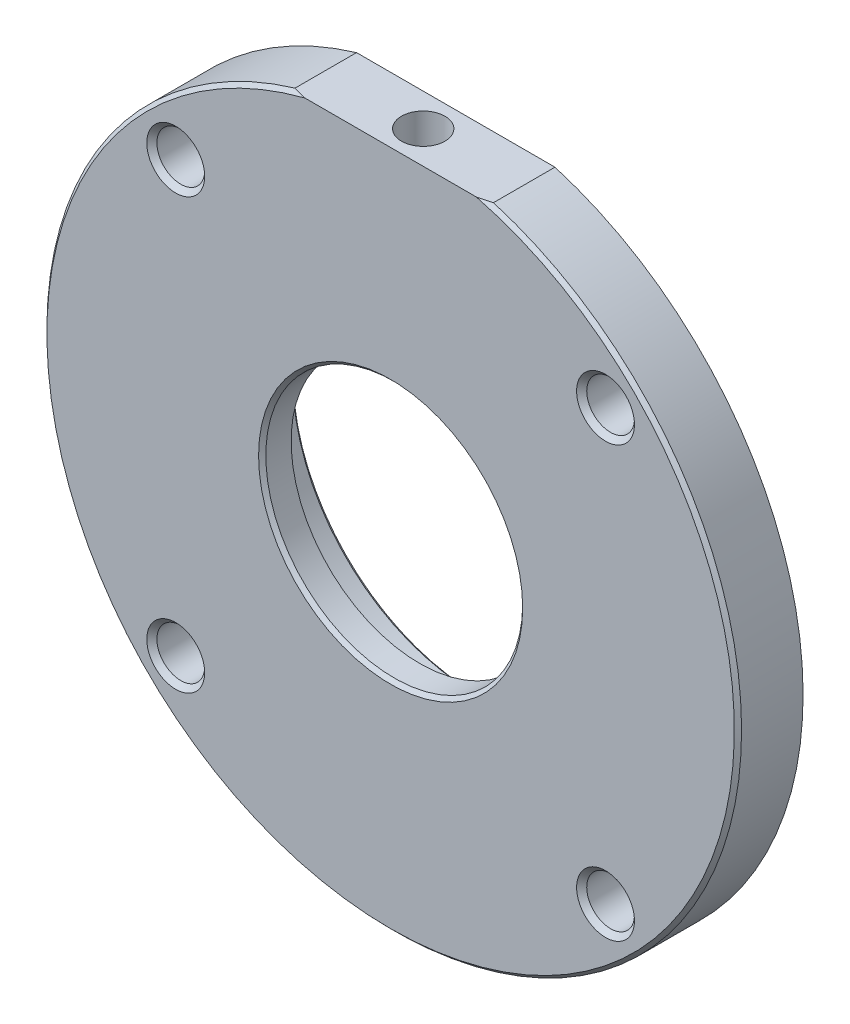
ISO-10303-21;
HEADER;
FILE_DESCRIPTION(('STEP AP214'),'2;1');
FILE_NAME('part.step','',(''),(''),'','','');
FILE_SCHEMA(('AUTOMOTIVE_DESIGN { 1 0 10303 214 1 1 1 1 }'));
ENDSEC;
DATA;
#1=APPLICATION_CONTEXT('core data for automotive mechanical design processes');
#2=APPLICATION_PROTOCOL_DEFINITION('international standard','automotive_design',2000,#1);
#3=PRODUCT_CONTEXT('',#1,'mechanical');
#4=PRODUCT('Part','Part','',(#3));
#5=PRODUCT_RELATED_PRODUCT_CATEGORY('part','',(#4));
#6=PRODUCT_DEFINITION_FORMATION('','',#4);
#7=PRODUCT_DEFINITION_CONTEXT('part definition',#1,'design');
#8=PRODUCT_DEFINITION('design','',#6,#7);
#9=PRODUCT_DEFINITION_SHAPE('','',#8);
#10=(LENGTH_UNIT() NAMED_UNIT(*) SI_UNIT(.MILLI.,.METRE.));
#11=(NAMED_UNIT(*) PLANE_ANGLE_UNIT() SI_UNIT($,.RADIAN.));
#12=(NAMED_UNIT(*) SI_UNIT($,.STERADIAN.) SOLID_ANGLE_UNIT());
#13=UNCERTAINTY_MEASURE_WITH_UNIT(LENGTH_MEASURE(1.E-05),#10,'distance_accuracy_value','');
#14=(GEOMETRIC_REPRESENTATION_CONTEXT(3) GLOBAL_UNCERTAINTY_ASSIGNED_CONTEXT((#13)) GLOBAL_UNIT_ASSIGNED_CONTEXT((#10,
#11,#12)) REPRESENTATION_CONTEXT('',''));
#15=CARTESIAN_POINT('',(0.,0.,0.));
#16=DIRECTION('',(0.,0.,1.));
#17=DIRECTION('',(1.,0.,0.));
#18=AXIS2_PLACEMENT_3D('',#15,#16,#17);
#19=CARTESIAN_POINT('',(0.,0.,0.));
#20=DIRECTION('',(0.,0.,-1.));
#21=DIRECTION('',(-1.,0.,0.));
#22=AXIS2_PLACEMENT_3D('',#19,#20,#21);
#23=CONICAL_SURFACE('',#22,47.5,0.78539816339745);
#24=CARTESIAN_POINT('',(-13.71375953158,46.,-0.500700000000002));
#25=CARTESIAN_POINT('',(-13.137539853745,46.,-0.336060837887307));
#26=CARTESIAN_POINT('',(-12.5587624728379,46.,-0.180246213723852));
#27=CARTESIAN_POINT('',(-11.3964003945171,46.,0.112639595623569));
#28=CARTESIAN_POINT('',(-10.8128150100109,46.,0.249708050821148));
#29=CARTESIAN_POINT('',(-9.64080204776412,46.,0.504069476417296));
#30=CARTESIAN_POINT('',(-9.05237069092193,46.,0.621345095971099));
#31=CARTESIAN_POINT('',(-7.87173652136038,46.,0.834946377333187));
#32=CARTESIAN_POINT('',(-7.27953388622874,46.,0.931273018219635));
#33=CARTESIAN_POINT('',(-6.10447555762479,46.,1.10028311112233));
#34=CARTESIAN_POINT('',(-5.52168542860216,46.,1.17342145793139));
#35=CARTESIAN_POINT('',(-4.35379693152289,46.,1.29806860137786));
#36=CARTESIAN_POINT('',(-3.76869859234998,46.,1.34957766781151));
#37=CARTESIAN_POINT('',(-2.59723108190088,46.,1.43044043828018));
#38=CARTESIAN_POINT('',(-2.01086259310787,46.,1.45980400480877));
#39=CARTESIAN_POINT('',(-0.837434610248634,46.,1.49611526775763));
#40=CARTESIAN_POINT('',(-0.250375123608757,46.,1.50306320292381));
#41=CARTESIAN_POINT('',(0.896105478622067,46.,1.49467478246648));
#42=CARTESIAN_POINT('',(1.45553439768135,46.,1.4803660119088));
#43=CARTESIAN_POINT('',(2.57354476144316,46.,1.43145082179596));
#44=CARTESIAN_POINT('',(3.13212614015884,46.,1.39684289570534));
#45=CARTESIAN_POINT('',(4.24787551950489,46.,1.30762945297654));
#46=CARTESIAN_POINT('',(4.80504297775503,46.,1.25301717169648));
#47=CARTESIAN_POINT('',(5.91712099853425,46.,1.12428150549659));
#48=CARTESIAN_POINT('',(6.47203152981437,46.,1.05015785135385));
#49=CARTESIAN_POINT('',(7.59034527063458,46.,0.881317311968279));
#50=CARTESIAN_POINT('',(8.15368932249866,46.,0.78620934649366));
#51=CARTESIAN_POINT('',(9.2768801887985,46.,0.577127142440375));
#52=CARTESIAN_POINT('',(9.8367268652952,46.,0.463152164547434));
#53=CARTESIAN_POINT('',(10.9520059362908,46.,0.217330177504767));
#54=CARTESIAN_POINT('',(11.5074414698607,46.,0.0854973644701607));
#55=CARTESIAN_POINT('',(12.6139428592477,46.,-0.195124542884481));
#56=CARTESIAN_POINT('',(13.1650092544586,46.,-0.343911508129344));
#57=CARTESIAN_POINT('',(13.71375953158,46.,-0.500700000000001));
#58=B_SPLINE_CURVE_WITH_KNOTS('',3,(#24,#25,#26,#27,#28,#29,#30,#31,#32,#33,#34,#35,#36,#37,#38,
#39,#40,#41,#42,#43,#44,#45,#46,#47,#48,#49,#50,#51,#52,#53,#54,#55,#56,#57),.UNSPECIFIED.,.F.,
.F.,(4,2,2,2,2,2,2,2,2,2,2,2,2,2,2,2,4),(0.,1.7978181737428,3.59589788384998,5.39554573483989,
7.19510945882882,8.95680263346868,10.7184738326969,12.4793600079967,14.2402274282712,
15.9186945633631,17.5972862844401,19.2764461603187,20.9556292068882,22.6692421503665,
24.3829222586143,26.0952479825346,27.807358911829),.UNSPECIFIED.);
#59=CARTESIAN_POINT('',(-13.7113092008021,46.,-0.500000000000003));
#60=VERTEX_POINT('',#59);
#61=CARTESIAN_POINT('',(-11.842719282327,46.,0.));
#62=VERTEX_POINT('',#61);
#63=EDGE_CURVE('E72',#60,#62,#58,.T.);
#64=ORIENTED_EDGE('',*,*,#63,.F.);
#65=CARTESIAN_POINT('',(0.,0.,-0.500000000000003));
#66=DIRECTION('',(0.,0.,1.));
#67=DIRECTION('',(1.,0.,0.));
#68=AXIS2_PLACEMENT_3D('',#65,#66,#67);
#69=CIRCLE('',#68,48.);
#70=CARTESIAN_POINT('',(13.7113092008021,46.,-0.500000000000003));
#71=VERTEX_POINT('',#70);
#72=EDGE_CURVE('E159',#60,#71,#69,.T.);
#73=ORIENTED_EDGE('',*,*,#72,.T.);
#74=CARTESIAN_POINT('',(11.842719282327,46.,0.));
#75=VERTEX_POINT('',#74);
#76=EDGE_CURVE('E166',#75,#71,#58,.T.);
#77=ORIENTED_EDGE('',*,*,#76,.F.);
#78=CARTESIAN_POINT('',(0.,0.,0.));
#79=DIRECTION('',(0.,0.,1.));
#80=DIRECTION('',(1.,0.,0.));
#81=AXIS2_PLACEMENT_3D('',#78,#79,#80);
#82=CIRCLE('',#81,47.5);
#83=EDGE_CURVE('E161',#62,#75,#82,.T.);
#84=ORIENTED_EDGE('',*,*,#83,.F.);
#85=EDGE_LOOP('',(#64,#73,#77,#84));
#86=FACE_BOUND('',#85,.T.);
#87=ADVANCED_FACE('F43',(#86),#23,.T.);
#88=CARTESIAN_POINT('',(0.,0.,0.));
#89=DIRECTION('',(0.,0.,1.));
#90=DIRECTION('',(1.,0.,0.));
#91=AXIS2_PLACEMENT_3D('',#88,#89,#90);
#92=CYLINDRICAL_SURFACE('',#91,48.);
#93=DIRECTION('',(0.,0.,1.));
#94=VECTOR('',#93,1.);
#95=CARTESIAN_POINT('',(13.7113092008021,46.,0.));
#96=LINE('',#95,#94);
#97=CARTESIAN_POINT('',(13.7113092008021,46.,-9.));
#98=VERTEX_POINT('',#97);
#99=EDGE_CURVE('E163',#71,#98,#96,.F.);
#100=ORIENTED_EDGE('',*,*,#99,.F.);
#101=ORIENTED_EDGE('',*,*,#72,.F.);
#102=DIRECTION('',(0.,0.,1.));
#103=VECTOR('',#102,1.);
#104=CARTESIAN_POINT('',(-13.7113092008021,46.,0.));
#105=LINE('',#104,#103);
#106=CARTESIAN_POINT('',(-13.7113092008021,46.,-9.));
#107=VERTEX_POINT('',#106);
#108=EDGE_CURVE('E164',#107,#60,#105,.T.);
#109=ORIENTED_EDGE('',*,*,#108,.F.);
#110=CARTESIAN_POINT('',(0.,0.,-9.));
#111=DIRECTION('',(0.,0.,1.));
#112=DIRECTION('',(1.,0.,0.));
#113=AXIS2_PLACEMENT_3D('',#110,#111,#112);
#114=CIRCLE('',#113,48.);
#115=EDGE_CURVE('E172',#107,#98,#114,.T.);
#116=ORIENTED_EDGE('',*,*,#115,.T.);
#117=EDGE_LOOP('',(#100,#101,#109,#116));
#118=FACE_BOUND('',#117,.T.);
#119=ADVANCED_FACE('F148',(#118),#92,.T.);
#120=CARTESIAN_POINT('',(0.,-48.,-9.));
#121=DIRECTION('',(0.,0.,-1.));
#122=DIRECTION('',(-1.,0.,0.));
#123=AXIS2_PLACEMENT_3D('',#120,#121,#122);
#124=PLANE('',#123);
#125=DIRECTION('',(-1.,0.,0.));
#126=VECTOR('',#125,1.);
#127=CARTESIAN_POINT('',(47.1254613262833,46.,-9.));
#128=LINE('',#127,#126);
#129=EDGE_CURVE('E398',#98,#107,#128,.T.);
#130=ORIENTED_EDGE('',*,*,#129,.F.);
#131=ORIENTED_EDGE('',*,*,#115,.F.);
#132=EDGE_LOOP('',(#130,#131));
#133=FACE_BOUND('',#132,.T.);
#134=CARTESIAN_POINT('',(-29.6984848098355,-29.6984848098345,-9.));
#135=DIRECTION('',(0.,0.,-1.));
#136=DIRECTION('',(-1.,0.,0.));
#137=AXIS2_PLACEMENT_3D('',#134,#135,#136);
#138=CIRCLE('',#137,4.);
#139=CARTESIAN_POINT('',(-33.6984848098355,-29.6984848098345,-9.));
#140=VERTEX_POINT('',#139);
#141=EDGE_CURVE('E279',#140,#140,#138,.T.);
#142=ORIENTED_EDGE('',*,*,#141,.F.);
#143=EDGE_LOOP('',(#142));
#144=FACE_BOUND('',#143,.T.);
#145=CARTESIAN_POINT('',(29.6984848098348,-29.6984848098352,-9.));
#146=DIRECTION('',(0.,0.,-1.));
#147=DIRECTION('',(-1.,0.,0.));
#148=AXIS2_PLACEMENT_3D('',#145,#146,#147);
#149=CIRCLE('',#148,4.);
#150=CARTESIAN_POINT('',(25.6984848098348,-29.6984848098352,-9.));
#151=VERTEX_POINT('',#150);
#152=EDGE_CURVE('E263',#151,#151,#149,.T.);
#153=ORIENTED_EDGE('',*,*,#152,.F.);
#154=EDGE_LOOP('',(#153));
#155=FACE_BOUND('',#154,.T.);
#156=CARTESIAN_POINT('',(29.6984848098353,29.6984848098347,-9.));
#157=DIRECTION('',(0.,0.,-1.));
#158=DIRECTION('',(-1.,0.,0.));
#159=AXIS2_PLACEMENT_3D('',#156,#157,#158);
#160=CIRCLE('',#159,4.);
#161=CARTESIAN_POINT('',(25.6984848098353,29.6984848098347,-9.));
#162=VERTEX_POINT('',#161);
#163=EDGE_CURVE('E247',#162,#162,#160,.T.);
#164=ORIENTED_EDGE('',*,*,#163,.F.);
#165=EDGE_LOOP('',(#164));
#166=FACE_BOUND('',#165,.T.);
#167=CARTESIAN_POINT('',(-29.6984848098348,29.6984848098352,-9.));
#168=DIRECTION('',(0.,0.,-1.));
#169=DIRECTION('',(-1.,0.,0.));
#170=AXIS2_PLACEMENT_3D('',#167,#168,#169);
#171=CIRCLE('',#170,4.);
#172=CARTESIAN_POINT('',(-33.6984848098348,29.6984848098352,-9.));
#173=VERTEX_POINT('',#172);
#174=EDGE_CURVE('E231',#173,#173,#171,.T.);
#175=ORIENTED_EDGE('',*,*,#174,.F.);
#176=EDGE_LOOP('',(#175));
#177=FACE_BOUND('',#176,.T.);
#178=CARTESIAN_POINT('',(0.,0.,-9.));
#179=DIRECTION('',(0.,0.,1.));
#180=DIRECTION('',(1.,0.,0.));
#181=AXIS2_PLACEMENT_3D('',#178,#179,#180);
#182=CIRCLE('',#181,36.);
#183=CARTESIAN_POINT('',(36.,0.,-9.));
#184=VERTEX_POINT('',#183);
#185=EDGE_CURVE('E175',#184,#184,#182,.T.);
#186=ORIENTED_EDGE('',*,*,#185,.T.);
#187=EDGE_LOOP('',(#186));
#188=FACE_BOUND('',#187,.T.);
#189=ADVANCED_FACE('F153',(#133,#144,#155,#166,#177,#188),#124,.T.);
#190=CARTESIAN_POINT('',(0.,0.,0.));
#191=DIRECTION('',(0.,0.,1.));
#192=DIRECTION('',(1.,0.,0.));
#193=AXIS2_PLACEMENT_3D('',#190,#191,#192);
#194=CYLINDRICAL_SURFACE('',#193,36.);
#195=CARTESIAN_POINT('',(0.,0.,-13.5));
#196=DIRECTION('',(0.,0.,1.));
#197=DIRECTION('',(1.,0.,0.));
#198=AXIS2_PLACEMENT_3D('',#195,#196,#197);
#199=CIRCLE('',#198,36.);
#200=CARTESIAN_POINT('',(36.,0.,-13.5));
#201=VERTEX_POINT('',#200);
#202=EDGE_CURVE('E181',#201,#201,#199,.T.);
#203=ORIENTED_EDGE('',*,*,#202,.T.);
#204=EDGE_LOOP('',(#203));
#205=FACE_BOUND('',#204,.T.);
#206=ORIENTED_EDGE('',*,*,#185,.F.);
#207=EDGE_LOOP('',(#206));
#208=FACE_BOUND('',#207,.T.);
#209=ADVANCED_FACE('F387',(#205,#208),#194,.T.);
#210=CARTESIAN_POINT('',(0.,0.,-13.5));
#211=DIRECTION('',(0.,0.,1.));
#212=DIRECTION('',(1.,0.,0.));
#213=AXIS2_PLACEMENT_3D('',#210,#211,#212);
#214=CONICAL_SURFACE('',#213,36.,0.785398163397448);
#215=CARTESIAN_POINT('',(0.,0.,-14.));
#216=DIRECTION('',(0.,0.,1.));
#217=DIRECTION('',(1.,0.,0.));
#218=AXIS2_PLACEMENT_3D('',#215,#216,#217);
#219=CIRCLE('',#218,35.5);
#220=CARTESIAN_POINT('',(35.5,0.,-14.));
#221=VERTEX_POINT('',#220);
#222=EDGE_CURVE('E185',#221,#221,#219,.T.);
#223=ORIENTED_EDGE('',*,*,#222,.T.);
#224=EDGE_LOOP('',(#223));
#225=FACE_BOUND('',#224,.T.);
#226=ORIENTED_EDGE('',*,*,#202,.F.);
#227=EDGE_LOOP('',(#226));
#228=FACE_BOUND('',#227,.T.);
#229=ADVANCED_FACE('F383',(#225,#228),#214,.T.);
#230=CARTESIAN_POINT('',(0.,-35.5,-14.));
#231=DIRECTION('',(0.,0.,-1.));
#232=DIRECTION('',(-1.,0.,0.));
#233=AXIS2_PLACEMENT_3D('',#230,#231,#232);
#234=PLANE('',#233);
#235=CARTESIAN_POINT('',(0.,0.,-14.));
#236=DIRECTION('',(0.,0.,1.));
#237=DIRECTION('',(1.,0.,0.));
#238=AXIS2_PLACEMENT_3D('',#235,#236,#237);
#239=CIRCLE('',#238,30.);
#240=CARTESIAN_POINT('',(30.,0.,-14.));
#241=VERTEX_POINT('',#240);
#242=EDGE_CURVE('E189',#241,#241,#239,.T.);
#243=ORIENTED_EDGE('',*,*,#242,.T.);
#244=EDGE_LOOP('',(#243));
#245=FACE_BOUND('',#244,.T.);
#246=ORIENTED_EDGE('',*,*,#222,.F.);
#247=EDGE_LOOP('',(#246));
#248=FACE_BOUND('',#247,.T.);
#249=ADVANCED_FACE('F379',(#245,#248),#234,.T.);
#250=CARTESIAN_POINT('',(0.,0.,0.));
#251=DIRECTION('',(0.,0.,1.));
#252=DIRECTION('',(1.,0.,0.));
#253=AXIS2_PLACEMENT_3D('',#250,#251,#252);
#254=CYLINDRICAL_SURFACE('',#253,30.);
#255=CARTESIAN_POINT('',(0.,0.,-12.));
#256=DIRECTION('',(0.,0.,1.));
#257=DIRECTION('',(1.,0.,0.));
#258=AXIS2_PLACEMENT_3D('',#255,#256,#257);
#259=CIRCLE('',#258,30.);
#260=CARTESIAN_POINT('',(30.,0.,-12.));
#261=VERTEX_POINT('',#260);
#262=EDGE_CURVE('E193',#261,#261,#259,.T.);
#263=ORIENTED_EDGE('',*,*,#262,.T.);
#264=EDGE_LOOP('',(#263));
#265=FACE_BOUND('',#264,.T.);
#266=ORIENTED_EDGE('',*,*,#242,.F.);
#267=EDGE_LOOP('',(#266));
#268=FACE_BOUND('',#267,.T.);
#269=ADVANCED_FACE('F375',(#265,#268),#254,.F.);
#270=CARTESIAN_POINT('',(0.,-30.,-12.));
#271=DIRECTION('',(0.,0.,-1.));
#272=DIRECTION('',(-1.,0.,0.));
#273=AXIS2_PLACEMENT_3D('',#270,#271,#272);
#274=PLANE('',#273);
#275=CARTESIAN_POINT('',(0.,28.,-12.));
#276=DIRECTION('',(0.,0.,-1.));
#277=DIRECTION('',(-1.,0.,0.));
#278=AXIS2_PLACEMENT_3D('',#275,#276,#277);
#279=CIRCLE('',#278,1.75);
#280=CARTESIAN_POINT('',(-1.75,28.,-12.));
#281=VERTEX_POINT('',#280);
#282=EDGE_CURVE('E110',#281,#281,#279,.T.);
#283=ORIENTED_EDGE('',*,*,#282,.F.);
#284=EDGE_LOOP('',(#283));
#285=FACE_BOUND('',#284,.T.);
#286=CARTESIAN_POINT('',(0.,0.,-12.));
#287=DIRECTION('',(0.,0.,1.));
#288=DIRECTION('',(1.,0.,0.));
#289=AXIS2_PLACEMENT_3D('',#286,#287,#288);
#290=CIRCLE('',#289,25.5);
#291=CARTESIAN_POINT('',(25.5,0.,-12.));
#292=VERTEX_POINT('',#291);
#293=EDGE_CURVE('E197',#292,#292,#290,.T.);
#294=ORIENTED_EDGE('',*,*,#293,.T.);
#295=EDGE_LOOP('',(#294));
#296=FACE_BOUND('',#295,.T.);
#297=ORIENTED_EDGE('',*,*,#262,.F.);
#298=EDGE_LOOP('',(#297));
#299=FACE_BOUND('',#298,.T.);
#300=ADVANCED_FACE('F371',(#285,#296,#299),#274,.T.);
#301=CARTESIAN_POINT('',(0.,0.,-12.));
#302=DIRECTION('',(0.,0.,-1.));
#303=DIRECTION('',(-1.,0.,0.));
#304=AXIS2_PLACEMENT_3D('',#301,#302,#303);
#305=CONICAL_SURFACE('',#304,25.5,0.78539816339745);
#306=CARTESIAN_POINT('',(0.,0.,-11.5));
#307=DIRECTION('',(0.,0.,1.));
#308=DIRECTION('',(1.,0.,0.));
#309=AXIS2_PLACEMENT_3D('',#306,#307,#308);
#310=CIRCLE('',#309,25.);
#311=CARTESIAN_POINT('',(25.,0.,-11.5));
#312=VERTEX_POINT('',#311);
#313=EDGE_CURVE('E201',#312,#312,#310,.T.);
#314=ORIENTED_EDGE('',*,*,#313,.T.);
#315=EDGE_LOOP('',(#314));
#316=FACE_BOUND('',#315,.T.);
#317=ORIENTED_EDGE('',*,*,#293,.F.);
#318=EDGE_LOOP('',(#317));
#319=FACE_BOUND('',#318,.T.);
#320=ADVANCED_FACE('F367',(#316,#319),#305,.F.);
#321=CARTESIAN_POINT('',(0.,0.,0.));
#322=DIRECTION('',(0.,0.,1.));
#323=DIRECTION('',(1.,0.,0.));
#324=AXIS2_PLACEMENT_3D('',#321,#322,#323);
#325=CYLINDRICAL_SURFACE('',#324,25.);
#326=CARTESIAN_POINT('',(0.,0.,-4.));
#327=DIRECTION('',(0.,0.,1.));
#328=DIRECTION('',(1.,0.,0.));
#329=AXIS2_PLACEMENT_3D('',#326,#327,#328);
#330=CIRCLE('',#329,25.);
#331=CARTESIAN_POINT('',(25.,0.,-4.));
#332=VERTEX_POINT('',#331);
#333=EDGE_CURVE('E205',#332,#332,#330,.T.);
#334=ORIENTED_EDGE('',*,*,#333,.T.);
#335=EDGE_LOOP('',(#334));
#336=FACE_BOUND('',#335,.T.);
#337=ORIENTED_EDGE('',*,*,#313,.F.);
#338=EDGE_LOOP('',(#337));
#339=FACE_BOUND('',#338,.T.);
#340=ADVANCED_FACE('F363',(#336,#339),#325,.F.);
#341=CARTESIAN_POINT('',(0.,-25.,-4.));
#342=DIRECTION('',(0.,0.,-1.));
#343=DIRECTION('',(-1.,0.,0.));
#344=AXIS2_PLACEMENT_3D('',#341,#342,#343);
#345=PLANE('',#344);
#346=CARTESIAN_POINT('',(0.,0.,-4.));
#347=DIRECTION('',(0.,0.,1.));
#348=DIRECTION('',(1.,0.,0.));
#349=AXIS2_PLACEMENT_3D('',#346,#347,#348);
#350=CIRCLE('',#349,17.75);
#351=CARTESIAN_POINT('',(17.75,0.,-4.));
#352=VERTEX_POINT('',#351);
#353=EDGE_CURVE('E209',#352,#352,#350,.T.);
#354=ORIENTED_EDGE('',*,*,#353,.T.);
#355=EDGE_LOOP('',(#354));
#356=FACE_BOUND('',#355,.T.);
#357=ORIENTED_EDGE('',*,*,#333,.F.);
#358=EDGE_LOOP('',(#357));
#359=FACE_BOUND('',#358,.T.);
#360=ADVANCED_FACE('F359',(#356,#359),#345,.T.);
#361=CARTESIAN_POINT('',(0.,0.,0.));
#362=DIRECTION('',(0.,0.,1.));
#363=DIRECTION('',(1.,0.,0.));
#364=AXIS2_PLACEMENT_3D('',#361,#362,#363);
#365=CYLINDRICAL_SURFACE('',#364,17.75);
#366=CARTESIAN_POINT('',(0.,0.,-0.499999999999997));
#367=DIRECTION('',(0.,0.,1.));
#368=DIRECTION('',(1.,0.,0.));
#369=AXIS2_PLACEMENT_3D('',#366,#367,#368);
#370=CIRCLE('',#369,17.75);
#371=CARTESIAN_POINT('',(17.75,0.,-0.499999999999997));
#372=VERTEX_POINT('',#371);
#373=EDGE_CURVE('E213',#372,#372,#370,.T.);
#374=ORIENTED_EDGE('',*,*,#373,.T.);
#375=EDGE_LOOP('',(#374));
#376=FACE_BOUND('',#375,.T.);
#377=ORIENTED_EDGE('',*,*,#353,.F.);
#378=EDGE_LOOP('',(#377));
#379=FACE_BOUND('',#378,.T.);
#380=ADVANCED_FACE('F355',(#376,#379),#365,.F.);
#381=CARTESIAN_POINT('',(0.,0.,-0.499999999999997));
#382=DIRECTION('',(0.,0.,1.));
#383=DIRECTION('',(1.,0.,0.));
#384=AXIS2_PLACEMENT_3D('',#381,#382,#383);
#385=CONICAL_SURFACE('',#384,17.75,0.785398163397452);
#386=CARTESIAN_POINT('',(0.,0.,0.));
#387=DIRECTION('',(0.,0.,1.));
#388=DIRECTION('',(1.,0.,0.));
#389=AXIS2_PLACEMENT_3D('',#386,#387,#388);
#390=CIRCLE('',#389,18.25);
#391=CARTESIAN_POINT('',(18.25,0.,0.));
#392=VERTEX_POINT('',#391);
#393=EDGE_CURVE('E217',#392,#392,#390,.T.);
#394=ORIENTED_EDGE('',*,*,#393,.T.);
#395=EDGE_LOOP('',(#394));
#396=FACE_BOUND('',#395,.T.);
#397=ORIENTED_EDGE('',*,*,#373,.F.);
#398=EDGE_LOOP('',(#397));
#399=FACE_BOUND('',#398,.T.);
#400=ADVANCED_FACE('F351',(#396,#399),#385,.F.);
#401=CARTESIAN_POINT('',(0.,-18.25,0.));
#402=DIRECTION('',(0.,0.,1.));
#403=DIRECTION('',(1.,0.,0.));
#404=AXIS2_PLACEMENT_3D('',#401,#402,#403);
#405=PLANE('',#404);
#406=DIRECTION('',(1.,0.,0.));
#407=VECTOR('',#406,1.);
#408=CARTESIAN_POINT('',(0.,46.,0.));
#409=LINE('',#408,#407);
#410=EDGE_CURVE('E125',#62,#75,#409,.T.);
#411=ORIENTED_EDGE('',*,*,#410,.F.);
#412=ORIENTED_EDGE('',*,*,#83,.T.);
#413=EDGE_LOOP('',(#411,#412));
#414=FACE_BOUND('',#413,.T.);
#415=CARTESIAN_POINT('',(-29.6984848098355,-29.6984848098345,0.));
#416=DIRECTION('',(0.,0.,-1.));
#417=DIRECTION('',(-1.,0.,0.));
#418=AXIS2_PLACEMENT_3D('',#415,#416,#417);
#419=CIRCLE('',#418,4.);
#420=CARTESIAN_POINT('',(-33.6984848098355,-29.6984848098345,0.));
#421=VERTEX_POINT('',#420);
#422=EDGE_CURVE('E283',#421,#421,#419,.T.);
#423=ORIENTED_EDGE('',*,*,#422,.T.);
#424=EDGE_LOOP('',(#423));
#425=FACE_BOUND('',#424,.T.);
#426=CARTESIAN_POINT('',(29.6984848098348,-29.6984848098352,0.));
#427=DIRECTION('',(0.,0.,-1.));
#428=DIRECTION('',(-1.,0.,0.));
#429=AXIS2_PLACEMENT_3D('',#426,#427,#428);
#430=CIRCLE('',#429,4.);
#431=CARTESIAN_POINT('',(25.6984848098348,-29.6984848098352,0.));
#432=VERTEX_POINT('',#431);
#433=EDGE_CURVE('E267',#432,#432,#430,.T.);
#434=ORIENTED_EDGE('',*,*,#433,.T.);
#435=EDGE_LOOP('',(#434));
#436=FACE_BOUND('',#435,.T.);
#437=CARTESIAN_POINT('',(29.6984848098353,29.6984848098347,0.));
#438=DIRECTION('',(0.,0.,-1.));
#439=DIRECTION('',(-1.,0.,0.));
#440=AXIS2_PLACEMENT_3D('',#437,#438,#439);
#441=CIRCLE('',#440,4.);
#442=CARTESIAN_POINT('',(25.6984848098353,29.6984848098347,0.));
#443=VERTEX_POINT('',#442);
#444=EDGE_CURVE('E251',#443,#443,#441,.T.);
#445=ORIENTED_EDGE('',*,*,#444,.T.);
#446=EDGE_LOOP('',(#445));
#447=FACE_BOUND('',#446,.T.);
#448=CARTESIAN_POINT('',(-29.6984848098348,29.6984848098352,0.));
#449=DIRECTION('',(0.,0.,-1.));
#450=DIRECTION('',(-1.,0.,0.));
#451=AXIS2_PLACEMENT_3D('',#448,#449,#450);
#452=CIRCLE('',#451,4.);
#453=CARTESIAN_POINT('',(-33.6984848098348,29.6984848098352,0.));
#454=VERTEX_POINT('',#453);
#455=EDGE_CURVE('E235',#454,#454,#452,.T.);
#456=ORIENTED_EDGE('',*,*,#455,.T.);
#457=EDGE_LOOP('',(#456));
#458=FACE_BOUND('',#457,.T.);
#459=ORIENTED_EDGE('',*,*,#393,.F.);
#460=EDGE_LOOP('',(#459));
#461=FACE_BOUND('',#460,.T.);
#462=ADVANCED_FACE('F347',(#414,#425,#436,#447,#458,#461),#405,.T.);
#463=CARTESIAN_POINT('',(-29.6984848098348,29.6984848098352,-0.700000000000006));
#464=DIRECTION('',(0.,0.,1.));
#465=DIRECTION('',(1.,0.,0.));
#466=AXIS2_PLACEMENT_3D('',#463,#464,#465);
#467=CONICAL_SURFACE('',#466,3.3,0.785398163397448);
#468=ORIENTED_EDGE('',*,*,#455,.F.);
#469=EDGE_LOOP('',(#468));
#470=FACE_BOUND('',#469,.T.);
#471=CARTESIAN_POINT('',(-29.6984848098348,29.6984848098352,-0.700000000000006));
#472=DIRECTION('',(0.,0.,-1.));
#473=DIRECTION('',(-1.,0.,0.));
#474=AXIS2_PLACEMENT_3D('',#471,#472,#473);
#475=CIRCLE('',#474,3.3);
#476=CARTESIAN_POINT('',(-32.9984848098348,29.6984848098352,-0.700000000000006));
#477=VERTEX_POINT('',#476);
#478=EDGE_CURVE('E223',#477,#477,#475,.T.);
#479=ORIENTED_EDGE('',*,*,#478,.T.);
#480=EDGE_LOOP('',(#479));
#481=FACE_BOUND('',#480,.T.);
#482=ADVANCED_FACE('F343',(#470,#481),#467,.F.);
#483=CARTESIAN_POINT('',(-29.6984848098348,29.6984848098352,-9.));
#484=DIRECTION('',(0.,0.,-1.));
#485=DIRECTION('',(-1.,0.,0.));
#486=AXIS2_PLACEMENT_3D('',#483,#484,#485);
#487=CYLINDRICAL_SURFACE('',#486,3.3);
#488=ORIENTED_EDGE('',*,*,#478,.F.);
#489=EDGE_LOOP('',(#488));
#490=FACE_BOUND('',#489,.T.);
#491=CARTESIAN_POINT('',(-29.6984848098348,29.6984848098352,-8.3));
#492=DIRECTION('',(0.,0.,-1.));
#493=DIRECTION('',(-1.,0.,0.));
#494=AXIS2_PLACEMENT_3D('',#491,#492,#493);
#495=CIRCLE('',#494,3.3);
#496=CARTESIAN_POINT('',(-32.9984848098348,29.6984848098352,-8.3));
#497=VERTEX_POINT('',#496);
#498=EDGE_CURVE('E227',#497,#497,#495,.T.);
#499=ORIENTED_EDGE('',*,*,#498,.T.);
#500=EDGE_LOOP('',(#499));
#501=FACE_BOUND('',#500,.T.);
#502=ADVANCED_FACE('F339',(#490,#501),#487,.F.);
#503=CARTESIAN_POINT('',(-29.6984848098348,29.6984848098352,-9.));
#504=DIRECTION('',(0.,0.,-1.));
#505=DIRECTION('',(-1.,0.,0.));
#506=AXIS2_PLACEMENT_3D('',#503,#504,#505);
#507=CONICAL_SURFACE('',#506,4.,0.78539816339745);
#508=ORIENTED_EDGE('',*,*,#498,.F.);
#509=EDGE_LOOP('',(#508));
#510=FACE_BOUND('',#509,.T.);
#511=ORIENTED_EDGE('',*,*,#174,.T.);
#512=EDGE_LOOP('',(#511));
#513=FACE_BOUND('',#512,.T.);
#514=ADVANCED_FACE('F335',(#510,#513),#507,.F.);
#515=CARTESIAN_POINT('',(29.6984848098353,29.6984848098347,-0.700000000000006));
#516=DIRECTION('',(0.,0.,1.));
#517=DIRECTION('',(1.,0.,0.));
#518=AXIS2_PLACEMENT_3D('',#515,#516,#517);
#519=CONICAL_SURFACE('',#518,3.3,0.785398163397446);
#520=ORIENTED_EDGE('',*,*,#444,.F.);
#521=EDGE_LOOP('',(#520));
#522=FACE_BOUND('',#521,.T.);
#523=CARTESIAN_POINT('',(29.6984848098353,29.6984848098347,-0.700000000000006));
#524=DIRECTION('',(0.,0.,-1.));
#525=DIRECTION('',(-1.,0.,0.));
#526=AXIS2_PLACEMENT_3D('',#523,#524,#525);
#527=CIRCLE('',#526,3.3);
#528=CARTESIAN_POINT('',(26.3984848098353,29.6984848098347,-0.700000000000006));
#529=VERTEX_POINT('',#528);
#530=EDGE_CURVE('E239',#529,#529,#527,.T.);
#531=ORIENTED_EDGE('',*,*,#530,.T.);
#532=EDGE_LOOP('',(#531));
#533=FACE_BOUND('',#532,.T.);
#534=ADVANCED_FACE('F331',(#522,#533),#519,.F.);
#535=CARTESIAN_POINT('',(29.6984848098353,29.6984848098347,-9.));
#536=DIRECTION('',(0.,0.,-1.));
#537=DIRECTION('',(-1.,0.,0.));
#538=AXIS2_PLACEMENT_3D('',#535,#536,#537);
#539=CYLINDRICAL_SURFACE('',#538,3.3);
#540=ORIENTED_EDGE('',*,*,#530,.F.);
#541=EDGE_LOOP('',(#540));
#542=FACE_BOUND('',#541,.T.);
#543=CARTESIAN_POINT('',(29.6984848098353,29.6984848098347,-8.3));
#544=DIRECTION('',(0.,0.,-1.));
#545=DIRECTION('',(-1.,0.,0.));
#546=AXIS2_PLACEMENT_3D('',#543,#544,#545);
#547=CIRCLE('',#546,3.3);
#548=CARTESIAN_POINT('',(26.3984848098353,29.6984848098347,-8.3));
#549=VERTEX_POINT('',#548);
#550=EDGE_CURVE('E243',#549,#549,#547,.T.);
#551=ORIENTED_EDGE('',*,*,#550,.T.);
#552=EDGE_LOOP('',(#551));
#553=FACE_BOUND('',#552,.T.);
#554=ADVANCED_FACE('F327',(#542,#553),#539,.F.);
#555=CARTESIAN_POINT('',(29.6984848098353,29.6984848098347,-9.));
#556=DIRECTION('',(0.,0.,-1.));
#557=DIRECTION('',(-1.,0.,0.));
#558=AXIS2_PLACEMENT_3D('',#555,#556,#557);
#559=CONICAL_SURFACE('',#558,4.,0.785398163397447);
#560=ORIENTED_EDGE('',*,*,#550,.F.);
#561=EDGE_LOOP('',(#560));
#562=FACE_BOUND('',#561,.T.);
#563=ORIENTED_EDGE('',*,*,#163,.T.);
#564=EDGE_LOOP('',(#563));
#565=FACE_BOUND('',#564,.T.);
#566=ADVANCED_FACE('F323',(#562,#565),#559,.F.);
#567=CARTESIAN_POINT('',(29.6984848098348,-29.6984848098352,-0.700000000000006));
#568=DIRECTION('',(0.,0.,1.));
#569=DIRECTION('',(1.,0.,0.));
#570=AXIS2_PLACEMENT_3D('',#567,#568,#569);
#571=CONICAL_SURFACE('',#570,3.3,0.785398163397446);
#572=ORIENTED_EDGE('',*,*,#433,.F.);
#573=EDGE_LOOP('',(#572));
#574=FACE_BOUND('',#573,.T.);
#575=CARTESIAN_POINT('',(29.6984848098348,-29.6984848098352,-0.700000000000006));
#576=DIRECTION('',(0.,0.,-1.));
#577=DIRECTION('',(-1.,0.,0.));
#578=AXIS2_PLACEMENT_3D('',#575,#576,#577);
#579=CIRCLE('',#578,3.3);
#580=CARTESIAN_POINT('',(26.3984848098348,-29.6984848098352,-0.700000000000006));
#581=VERTEX_POINT('',#580);
#582=EDGE_CURVE('E255',#581,#581,#579,.T.);
#583=ORIENTED_EDGE('',*,*,#582,.T.);
#584=EDGE_LOOP('',(#583));
#585=FACE_BOUND('',#584,.T.);
#586=ADVANCED_FACE('F319',(#574,#585),#571,.F.);
#587=CARTESIAN_POINT('',(29.6984848098348,-29.6984848098352,-9.));
#588=DIRECTION('',(0.,0.,-1.));
#589=DIRECTION('',(-1.,0.,0.));
#590=AXIS2_PLACEMENT_3D('',#587,#588,#589);
#591=CYLINDRICAL_SURFACE('',#590,3.3);
#592=ORIENTED_EDGE('',*,*,#582,.F.);
#593=EDGE_LOOP('',(#592));
#594=FACE_BOUND('',#593,.T.);
#595=CARTESIAN_POINT('',(29.6984848098348,-29.6984848098352,-8.3));
#596=DIRECTION('',(0.,0.,-1.));
#597=DIRECTION('',(-1.,0.,0.));
#598=AXIS2_PLACEMENT_3D('',#595,#596,#597);
#599=CIRCLE('',#598,3.3);
#600=CARTESIAN_POINT('',(26.3984848098348,-29.6984848098352,-8.3));
#601=VERTEX_POINT('',#600);
#602=EDGE_CURVE('E259',#601,#601,#599,.T.);
#603=ORIENTED_EDGE('',*,*,#602,.T.);
#604=EDGE_LOOP('',(#603));
#605=FACE_BOUND('',#604,.T.);
#606=ADVANCED_FACE('F315',(#594,#605),#591,.F.);
#607=CARTESIAN_POINT('',(29.6984848098348,-29.6984848098352,-9.));
#608=DIRECTION('',(0.,0.,-1.));
#609=DIRECTION('',(-1.,0.,0.));
#610=AXIS2_PLACEMENT_3D('',#607,#608,#609);
#611=CONICAL_SURFACE('',#610,4.,0.785398163397447);
#612=ORIENTED_EDGE('',*,*,#602,.F.);
#613=EDGE_LOOP('',(#612));
#614=FACE_BOUND('',#613,.T.);
#615=ORIENTED_EDGE('',*,*,#152,.T.);
#616=EDGE_LOOP('',(#615));
#617=FACE_BOUND('',#616,.T.);
#618=ADVANCED_FACE('F311',(#614,#617),#611,.F.);
#619=CARTESIAN_POINT('',(-29.6984848098355,-29.6984848098345,-0.700000000000006));
#620=DIRECTION('',(0.,0.,1.));
#621=DIRECTION('',(1.,0.,0.));
#622=AXIS2_PLACEMENT_3D('',#619,#620,#621);
#623=CONICAL_SURFACE('',#622,3.3,0.785398163397448);
#624=ORIENTED_EDGE('',*,*,#422,.F.);
#625=EDGE_LOOP('',(#624));
#626=FACE_BOUND('',#625,.T.);
#627=CARTESIAN_POINT('',(-29.6984848098355,-29.6984848098345,-0.700000000000006));
#628=DIRECTION('',(0.,0.,-1.));
#629=DIRECTION('',(-1.,0.,0.));
#630=AXIS2_PLACEMENT_3D('',#627,#628,#629);
#631=CIRCLE('',#630,3.3);
#632=CARTESIAN_POINT('',(-32.9984848098355,-29.6984848098345,-0.700000000000006));
#633=VERTEX_POINT('',#632);
#634=EDGE_CURVE('E271',#633,#633,#631,.T.);
#635=ORIENTED_EDGE('',*,*,#634,.T.);
#636=EDGE_LOOP('',(#635));
#637=FACE_BOUND('',#636,.T.);
#638=ADVANCED_FACE('F307',(#626,#637),#623,.F.);
#639=CARTESIAN_POINT('',(-29.6984848098355,-29.6984848098345,-9.));
#640=DIRECTION('',(0.,0.,-1.));
#641=DIRECTION('',(-1.,0.,0.));
#642=AXIS2_PLACEMENT_3D('',#639,#640,#641);
#643=CYLINDRICAL_SURFACE('',#642,3.3);
#644=ORIENTED_EDGE('',*,*,#634,.F.);
#645=EDGE_LOOP('',(#644));
#646=FACE_BOUND('',#645,.T.);
#647=CARTESIAN_POINT('',(-29.6984848098355,-29.6984848098345,-8.3));
#648=DIRECTION('',(0.,0.,-1.));
#649=DIRECTION('',(-1.,0.,0.));
#650=AXIS2_PLACEMENT_3D('',#647,#648,#649);
#651=CIRCLE('',#650,3.3);
#652=CARTESIAN_POINT('',(-32.9984848098355,-29.6984848098345,-8.3));
#653=VERTEX_POINT('',#652);
#654=EDGE_CURVE('E275',#653,#653,#651,.T.);
#655=ORIENTED_EDGE('',*,*,#654,.T.);
#656=EDGE_LOOP('',(#655));
#657=FACE_BOUND('',#656,.T.);
#658=ADVANCED_FACE('F303',(#646,#657),#643,.F.);
#659=CARTESIAN_POINT('',(-29.6984848098355,-29.6984848098345,-9.));
#660=DIRECTION('',(0.,0.,-1.));
#661=DIRECTION('',(-1.,0.,0.));
#662=AXIS2_PLACEMENT_3D('',#659,#660,#661);
#663=CONICAL_SURFACE('',#662,4.,0.78539816339745);
#664=ORIENTED_EDGE('',*,*,#654,.F.);
#665=EDGE_LOOP('',(#664));
#666=FACE_BOUND('',#665,.T.);
#667=ORIENTED_EDGE('',*,*,#141,.T.);
#668=EDGE_LOOP('',(#667));
#669=FACE_BOUND('',#668,.T.);
#670=ADVANCED_FACE('F299',(#666,#669),#663,.F.);
#671=CARTESIAN_POINT('',(47.1254613262833,46.,0.));
#672=DIRECTION('',(0.,-1.,0.));
#673=DIRECTION('',(0.,0.,-1.));
#674=AXIS2_PLACEMENT_3D('',#671,#672,#673);
#675=PLANE('',#674);
#676=CARTESIAN_POINT('',(0.,46.,-4.5));
#677=DIRECTION('',(0.,1.,0.));
#678=DIRECTION('',(0.,0.,1.));
#679=AXIS2_PLACEMENT_3D('',#676,#677,#678);
#680=CIRCLE('',#679,3.);
#681=CARTESIAN_POINT('',(0.,46.,-1.5));
#682=VERTEX_POINT('',#681);
#683=EDGE_CURVE('E435',#682,#682,#680,.T.);
#684=ORIENTED_EDGE('',*,*,#683,.F.);
#685=EDGE_LOOP('',(#684));
#686=FACE_BOUND('',#685,.T.);
#687=ORIENTED_EDGE('',*,*,#76,.T.);
#688=ORIENTED_EDGE('',*,*,#99,.T.);
#689=ORIENTED_EDGE('',*,*,#129,.T.);
#690=ORIENTED_EDGE('',*,*,#108,.T.);
#691=ORIENTED_EDGE('',*,*,#63,.T.);
#692=ORIENTED_EDGE('',*,*,#410,.T.);
#693=EDGE_LOOP('',(#687,#688,#689,#690,#691,#692));
#694=FACE_BOUND('',#693,.T.);
#695=ADVANCED_FACE('F295',(#686,#694),#675,.F.);
#696=CARTESIAN_POINT('',(0.,28.,-2.90129092854134));
#697=DIRECTION('',(0.,0.,-1.));
#698=DIRECTION('',(-1.,0.,0.));
#699=AXIS2_PLACEMENT_3D('',#696,#697,#698);
#700=CONICAL_SURFACE('',#699,1.5,1.02974425867665);
#701=CARTESIAN_POINT('',(0.,28.,-2.));
#702=VERTEX_POINT('',#701);
#703=VERTEX_LOOP('',#702);
#704=FACE_BOUND('',#703,.T.);
#705=CARTESIAN_POINT('',(0.,28.,-2.90129092854134));
#706=DIRECTION('',(0.,0.,-1.));
#707=DIRECTION('',(-1.,0.,0.));
#708=AXIS2_PLACEMENT_3D('',#705,#706,#707);
#709=CIRCLE('',#708,1.5);
#710=CARTESIAN_POINT('',(-1.5,28.,-2.90129092854134));
#711=VERTEX_POINT('',#710);
#712=EDGE_CURVE('E414',#711,#711,#709,.T.);
#713=ORIENTED_EDGE('',*,*,#712,.T.);
#714=EDGE_LOOP('',(#713));
#715=FACE_BOUND('',#714,.T.);
#716=ADVANCED_FACE('F144',(#704,#715),#700,.F.);
#717=CARTESIAN_POINT('',(0.,28.,-12.));
#718=DIRECTION('',(0.,0.,-1.));
#719=DIRECTION('',(-1.,0.,0.));
#720=AXIS2_PLACEMENT_3D('',#717,#718,#719);
#721=CYLINDRICAL_SURFACE('',#720,1.5);
#722=CARTESIAN_POINT('',(0.,28.,-4.5));
#723=DIRECTION('',(0.,0.707106781186547,-0.707106781186547));
#724=DIRECTION('',(0.,-0.707106781186547,-0.707106781186547));
#725=AXIS2_PLACEMENT_3D('',#722,#723,#724);
#726=ELLIPSE('',#725,2.12132034355964,1.5);
#727=CARTESIAN_POINT('',(-1.19903071775876,28.9012909285413,-3.59870907145866));
#728=VERTEX_POINT('',#727);
#729=CARTESIAN_POINT('',(1.19903071775876,28.9012909285413,-3.59870907145866));
#730=VERTEX_POINT('',#729);
#731=EDGE_CURVE('E58',#728,#730,#726,.T.);
#732=ORIENTED_EDGE('',*,*,#731,.T.);
#733=CARTESIAN_POINT('',(1.0480650263583,29.0731074971896,-3.05390874265371));
#734=CARTESIAN_POINT('',(1.0623824939134,29.0591221945995,-3.09303725450808));
#735=CARTESIAN_POINT('',(1.07595320049535,29.0453101851045,-3.13249375570868));
#736=CARTESIAN_POINT('',(1.10173495917197,29.0181030780386,-3.21219230440411));
#737=CARTESIAN_POINT('',(1.11394008857382,29.0047099652925,-3.25243694677063));
#738=CARTESIAN_POINT('',(1.14954702123178,28.9642962245099,-3.37759436311198));
#739=CARTESIAN_POINT('',(1.17069244777501,28.9382933919873,-3.46349293603362));
#740=CARTESIAN_POINT('',(1.20756996903952,28.8903311939236,-3.63761246178944));
#741=CARTESIAN_POINT('',(1.22329887397039,28.8683742145121,-3.72583475025551));
#742=CARTESIAN_POINT('',(1.24948971414367,28.8302477533242,-3.90407686385973));
#743=CARTESIAN_POINT('',(1.25996538125784,28.8140632148451,-3.99409135625199));
#744=CARTESIAN_POINT('',(1.27572617287918,28.7891424282546,-4.17556838708595));
#745=CARTESIAN_POINT('',(1.28101499196054,28.7804008791131,-4.26702984760178));
#746=CARTESIAN_POINT('',(1.28628102790358,28.7716915971412,-4.44751032250717));
#747=CARTESIAN_POINT('',(1.28642764819747,28.7714440459926,-4.53651042288004));
#748=CARTESIAN_POINT('',(1.28183391877677,28.779050237065,-4.71405850083161));
#749=CARTESIAN_POINT('',(1.27709162617156,28.7869072000813,-4.80260628459717));
#750=CARTESIAN_POINT('',(1.26275281303704,28.809711169235,-4.97842130843048));
#751=CARTESIAN_POINT('',(1.25315242528082,28.824663823219,-5.06568747124213));
#752=CARTESIAN_POINT('',(1.22909081300334,28.8601116832784,-5.23835736139901));
#753=CARTESIAN_POINT('',(1.21463086185164,28.8806054371241,-5.32376157040265));
#754=CARTESIAN_POINT('',(1.18748845068359,28.9166007193373,-5.4587051818765));
#755=CARTESIAN_POINT('',(1.17640930733843,28.9308192975944,-5.5089234431646));
#756=CARTESIAN_POINT('',(1.15237331208596,28.9604161482054,-5.60857671951013));
#757=CARTESIAN_POINT('',(1.13941603862785,28.9757946805412,-5.65801155595525));
#758=CARTESIAN_POINT('',(1.10584930577358,29.0138932180341,-5.77600786931844));
#759=CARTESIAN_POINT('',(1.08427303854157,29.03705149034,-5.84415578645626));
#760=CARTESIAN_POINT('',(1.03681634522005,29.0844997890344,-5.97859316919422));
#761=CARTESIAN_POINT('',(1.0109332682943,29.1087905057718,-6.04488146064976));
#762=CARTESIAN_POINT('',(0.954382167074238,29.1578226592858,-6.17499663410237));
#763=CARTESIAN_POINT('',(0.9237267042415,29.1825627663599,-6.23882944425164));
#764=CARTESIAN_POINT('',(0.856817363494052,29.2319067043605,-6.36350530407076));
#765=CARTESIAN_POINT('',(0.820570676851288,29.2565106688656,-6.42435206363928));
#766=CARTESIAN_POINT('',(0.76989735399482,29.2874102465423,-6.49957573053927));
#767=CARTESIAN_POINT('',(0.758548166678583,29.2941345286323,-6.51587121868393));
#768=CARTESIAN_POINT('',(0.735289941873659,29.3074895251673,-6.54810116123015));
#769=CARTESIAN_POINT('',(0.723380811112122,29.3141202237826,-6.56403555482239));
#770=CARTESIAN_POINT('',(0.711175629295862,29.320692706235,-6.57976946330831));
#771=B_SPLINE_CURVE_WITH_KNOTS('',3,(#733,#734,#735,#736,#737,#738,#739,#740,#741,#742,#743,
#744,#745,#746,#747,#748,#749,#750,#751,#752,#753,#754,#755,#756,#757,#758,#759,#760,#761,#762,
#763,#764,#765,#766,#767,#768,#769,#770),.UNSPECIFIED.,.F.,.F.,(4,2,2,2,2,2,2,2,2,2,2,2,2,2,2,2,
2,2,4),(0.,0.131831007559546,0.264213267779743,0.540546460494357,0.817042108690868,
1.09281118470943,1.36838368837758,1.63486895831123,1.90146017232705,2.16826393762508,
2.43499784577457,2.59501855130895,2.755075229652,2.98034518768333,3.20575431549635,
3.43057987096321,3.65511863687352,3.71800721315442,3.78090630250265),.UNSPECIFIED.);
#772=CARTESIAN_POINT('',(1.19903071775876,28.9012909285413,-5.40129092854134));
#773=VERTEX_POINT('',#772);
#774=EDGE_CURVE('E11',#730,#773,#771,.T.);
#775=ORIENTED_EDGE('',*,*,#774,.T.);
#776=CARTESIAN_POINT('',(0.,28.,-4.5));
#777=DIRECTION('',(0.,-0.707106781186547,-0.707106781186547));
#778=DIRECTION('',(0.,0.707106781186547,-0.707106781186547));
#779=AXIS2_PLACEMENT_3D('',#776,#777,#778);
#780=ELLIPSE('',#779,2.12132034355964,1.5);
#781=CARTESIAN_POINT('',(-1.19903071775876,28.9012909285413,-5.40129092854134));
#782=VERTEX_POINT('',#781);
#783=EDGE_CURVE('E108',#773,#782,#780,.F.);
#784=ORIENTED_EDGE('',*,*,#783,.T.);
#785=CARTESIAN_POINT('',(-1.0480650263583,29.0731074971896,-5.94609125734629));
#786=CARTESIAN_POINT('',(-1.0623824939134,29.0591221945995,-5.90696274549192));
#787=CARTESIAN_POINT('',(-1.07595320049535,29.0453101851045,-5.86750624429132));
#788=CARTESIAN_POINT('',(-1.10173495917198,29.0181030780386,-5.78780769559588));
#789=CARTESIAN_POINT('',(-1.11394008857382,29.0047099652925,-5.74756305322935));
#790=CARTESIAN_POINT('',(-1.14954702123178,28.9642962245099,-5.622405636888));
#791=CARTESIAN_POINT('',(-1.17069244777502,28.9382933919873,-5.53650706396636));
#792=CARTESIAN_POINT('',(-1.20756996903952,28.8903311939236,-5.36238753821054));
#793=CARTESIAN_POINT('',(-1.22329887397039,28.8683742145121,-5.27416524974447));
#794=CARTESIAN_POINT('',(-1.24948971414367,28.8302477533242,-5.09592313614025));
#795=CARTESIAN_POINT('',(-1.25996538125784,28.8140632148451,-5.005908643748));
#796=CARTESIAN_POINT('',(-1.27572617287918,28.7891424282546,-4.82443161291404));
#797=CARTESIAN_POINT('',(-1.28101499196054,28.7804008791131,-4.73297015239821));
#798=CARTESIAN_POINT('',(-1.28628102790358,28.7716915971412,-4.55248967749282));
#799=CARTESIAN_POINT('',(-1.28642764819747,28.7714440459926,-4.46348957711995));
#800=CARTESIAN_POINT('',(-1.28183391877677,28.779050237065,-4.28594149916838));
#801=CARTESIAN_POINT('',(-1.27709162617156,28.7869072000813,-4.19739371540282));
#802=CARTESIAN_POINT('',(-1.26275281303704,28.809711169235,-4.02157869156952));
#803=CARTESIAN_POINT('',(-1.25315242528082,28.824663823219,-3.93431252875787));
#804=CARTESIAN_POINT('',(-1.22909081300334,28.8601116832784,-3.76164263860098));
#805=CARTESIAN_POINT('',(-1.21463086185164,28.8806054371241,-3.67623842959735));
#806=CARTESIAN_POINT('',(-1.18748845068359,28.9166007193373,-3.5412948181235));
#807=CARTESIAN_POINT('',(-1.17640930733842,28.9308192975944,-3.49107655683539));
#808=CARTESIAN_POINT('',(-1.15237331208595,28.9604161482055,-3.39142328048985));
#809=CARTESIAN_POINT('',(-1.13941603862784,28.9757946805412,-3.34198844404473));
#810=CARTESIAN_POINT('',(-1.10584930577357,29.0138932180341,-3.22399213068154));
#811=CARTESIAN_POINT('',(-1.08427303854156,29.03705149034,-3.15584421354372));
#812=CARTESIAN_POINT('',(-1.03681634522004,29.0844997890344,-3.02140683080576));
#813=CARTESIAN_POINT('',(-1.01093326829429,29.1087905057718,-2.95511853935022));
#814=CARTESIAN_POINT('',(-0.954382167074225,29.1578226592858,-2.82500336589761));
#815=CARTESIAN_POINT('',(-0.923726704241486,29.1825627663599,-2.76117055574833));
#816=CARTESIAN_POINT('',(-0.856817363494036,29.2319067043605,-2.63649469592922));
#817=CARTESIAN_POINT('',(-0.820570676851271,29.2565106688656,-2.57564793636069));
#818=CARTESIAN_POINT('',(-0.769897353994804,29.2874102465423,-2.50042426946072));
#819=CARTESIAN_POINT('',(-0.75854816667857,29.2941345286324,-2.48412878131605));
#820=CARTESIAN_POINT('',(-0.735289941873652,29.3074895251673,-2.45189883876984));
#821=CARTESIAN_POINT('',(-0.723380811112118,29.3141202237826,-2.43596444517761));
#822=CARTESIAN_POINT('',(-0.711175629295862,29.320692706235,-2.4202305366917));
#823=B_SPLINE_CURVE_WITH_KNOTS('',3,(#785,#786,#787,#788,#789,#790,#791,#792,#793,#794,#795,
#796,#797,#798,#799,#800,#801,#802,#803,#804,#805,#806,#807,#808,#809,#810,#811,#812,#813,#814,
#815,#816,#817,#818,#819,#820,#821,#822),.UNSPECIFIED.,.F.,.F.,(4,2,2,2,2,2,2,2,2,2,2,2,2,2,2,2,
2,2,4),(0.,0.13183100755956,0.26421326777977,0.540546460494382,0.817042108690891,
1.09281118470945,1.3683836883776,1.63486895831124,1.90146017232706,2.16826393762509,
2.43499784577458,2.59501855130897,2.75507522965202,2.98034518768335,3.20575431549638,
3.43057987096324,3.65511863687356,3.71800721315444,3.78090630250265),.UNSPECIFIED.);
#824=EDGE_CURVE('E114',#782,#728,#823,.T.);
#825=ORIENTED_EDGE('',*,*,#824,.T.);
#826=EDGE_LOOP('',(#732,#775,#784,#825));
#827=FACE_BOUND('',#826,.T.);
#828=ORIENTED_EDGE('',*,*,#712,.F.);
#829=EDGE_LOOP('',(#828));
#830=FACE_BOUND('',#829,.T.);
#831=CARTESIAN_POINT('',(0.,28.,-11.75));
#832=DIRECTION('',(0.,0.,-1.));
#833=DIRECTION('',(-1.,0.,0.));
#834=AXIS2_PLACEMENT_3D('',#831,#832,#833);
#835=CIRCLE('',#834,1.5);
#836=CARTESIAN_POINT('',(-1.5,28.,-11.75));
#837=VERTEX_POINT('',#836);
#838=EDGE_CURVE('E418',#837,#837,#835,.T.);
#839=ORIENTED_EDGE('',*,*,#838,.T.);
#840=EDGE_LOOP('',(#839));
#841=FACE_BOUND('',#840,.T.);
#842=ADVANCED_FACE('F112',(#827,#830,#841),#721,.F.);
#843=CARTESIAN_POINT('',(0.,28.,-12.));
#844=DIRECTION('',(0.,0.,-1.));
#845=DIRECTION('',(-1.,0.,0.));
#846=AXIS2_PLACEMENT_3D('',#843,#844,#845);
#847=CONICAL_SURFACE('',#846,1.75,0.78539816339745);
#848=ORIENTED_EDGE('',*,*,#838,.F.);
#849=EDGE_LOOP('',(#848));
#850=FACE_BOUND('',#849,.T.);
#851=ORIENTED_EDGE('',*,*,#282,.T.);
#852=EDGE_LOOP('',(#851));
#853=FACE_BOUND('',#852,.T.);
#854=ADVANCED_FACE('F135',(#850,#853),#847,.F.);
#855=CARTESIAN_POINT('',(0.,46.,-4.5));
#856=DIRECTION('',(0.,1.,0.));
#857=DIRECTION('',(0.,0.,1.));
#858=AXIS2_PLACEMENT_3D('',#855,#856,#857);
#859=CYLINDRICAL_SURFACE('',#858,1.5);
#860=CARTESIAN_POINT('',(0.,38.0987090714587,-4.5));
#861=DIRECTION('',(0.,1.,0.));
#862=DIRECTION('',(0.,0.,1.));
#863=AXIS2_PLACEMENT_3D('',#860,#861,#862);
#864=CIRCLE('',#863,1.5);
#865=CARTESIAN_POINT('',(0.,38.0987090714587,-3.));
#866=VERTEX_POINT('',#865);
#867=EDGE_CURVE('E427',#866,#866,#864,.T.);
#868=ORIENTED_EDGE('',*,*,#867,.T.);
#869=EDGE_LOOP('',(#868));
#870=FACE_BOUND('',#869,.T.);
#871=CARTESIAN_POINT('',(0.,28.9012909285413,-4.5));
#872=DIRECTION('',(0.,1.,0.));
#873=DIRECTION('',(0.,0.,1.));
#874=AXIS2_PLACEMENT_3D('',#871,#872,#873);
#875=CIRCLE('',#874,1.5);
#876=EDGE_CURVE('E64',#782,#728,#875,.T.);
#877=ORIENTED_EDGE('',*,*,#876,.F.);
#878=ORIENTED_EDGE('',*,*,#783,.F.);
#879=EDGE_CURVE('E101',#730,#773,#875,.T.);
#880=ORIENTED_EDGE('',*,*,#879,.F.);
#881=ORIENTED_EDGE('',*,*,#731,.F.);
#882=EDGE_LOOP('',(#877,#878,#880,#881));
#883=FACE_BOUND('',#882,.T.);
#884=ADVANCED_FACE('F106',(#870,#883),#859,.F.);
#885=CARTESIAN_POINT('',(0.,28.9012909285413,-4.5));
#886=DIRECTION('',(0.,1.,0.));
#887=DIRECTION('',(0.,0.,1.));
#888=AXIS2_PLACEMENT_3D('',#885,#886,#887);
#889=CONICAL_SURFACE('',#888,1.5,1.02974425867666);
#890=ORIENTED_EDGE('',*,*,#879,.T.);
#891=ORIENTED_EDGE('',*,*,#774,.F.);
#892=EDGE_LOOP('',(#890,#891));
#893=FACE_BOUND('',#892,.T.);
#894=ADVANCED_FACE('F100',(#893),#889,.F.);
#895=ORIENTED_EDGE('',*,*,#876,.T.);
#896=ORIENTED_EDGE('',*,*,#824,.F.);
#897=EDGE_LOOP('',(#895,#896));
#898=FACE_BOUND('',#897,.T.);
#899=ADVANCED_FACE('F133',(#898),#889,.F.);
#900=CARTESIAN_POINT('',(0.,39.,-4.5));
#901=DIRECTION('',(0.,1.,0.));
#902=DIRECTION('',(0.,0.,1.));
#903=AXIS2_PLACEMENT_3D('',#900,#901,#902);
#904=CONICAL_SURFACE('',#903,3.,1.02974425867666);
#905=ORIENTED_EDGE('',*,*,#867,.F.);
#906=EDGE_LOOP('',(#905));
#907=FACE_BOUND('',#906,.T.);
#908=CARTESIAN_POINT('',(0.,39.,-4.5));
#909=DIRECTION('',(0.,1.,0.));
#910=DIRECTION('',(0.,0.,1.));
#911=AXIS2_PLACEMENT_3D('',#908,#909,#910);
#912=CIRCLE('',#911,3.);
#913=CARTESIAN_POINT('',(0.,39.,-1.5));
#914=VERTEX_POINT('',#913);
#915=EDGE_CURVE('E431',#914,#914,#912,.T.);
#916=ORIENTED_EDGE('',*,*,#915,.T.);
#917=EDGE_LOOP('',(#916));
#918=FACE_BOUND('',#917,.T.);
#919=ADVANCED_FACE('F488',(#907,#918),#904,.F.);
#920=CARTESIAN_POINT('',(0.,46.,-4.5));
#921=DIRECTION('',(0.,1.,0.));
#922=DIRECTION('',(0.,0.,1.));
#923=AXIS2_PLACEMENT_3D('',#920,#921,#922);
#924=CYLINDRICAL_SURFACE('',#923,3.);
#925=ORIENTED_EDGE('',*,*,#915,.F.);
#926=EDGE_LOOP('',(#925));
#927=FACE_BOUND('',#926,.T.);
#928=ORIENTED_EDGE('',*,*,#683,.T.);
#929=EDGE_LOOP('',(#928));
#930=FACE_BOUND('',#929,.T.);
#931=ADVANCED_FACE('F440',(#927,#930),#924,.F.);
#932=CLOSED_SHELL('',(#87,#119,#189,#209,#229,#249,#269,#300,#320,#340,#360,#380,#400,#462,#482,
#502,#514,#534,#554,#566,#586,#606,#618,#638,#658,#670,#695,#716,#842,#854,#884,#894,#899,#919,#931));
#933=MANIFOLD_SOLID_BREP('B2',#932);
#934=ADVANCED_BREP_SHAPE_REPRESENTATION('',(#18,#933),#14);
#935=SHAPE_DEFINITION_REPRESENTATION(#9,#934);
ENDSEC;
END-ISO-10303-21;
